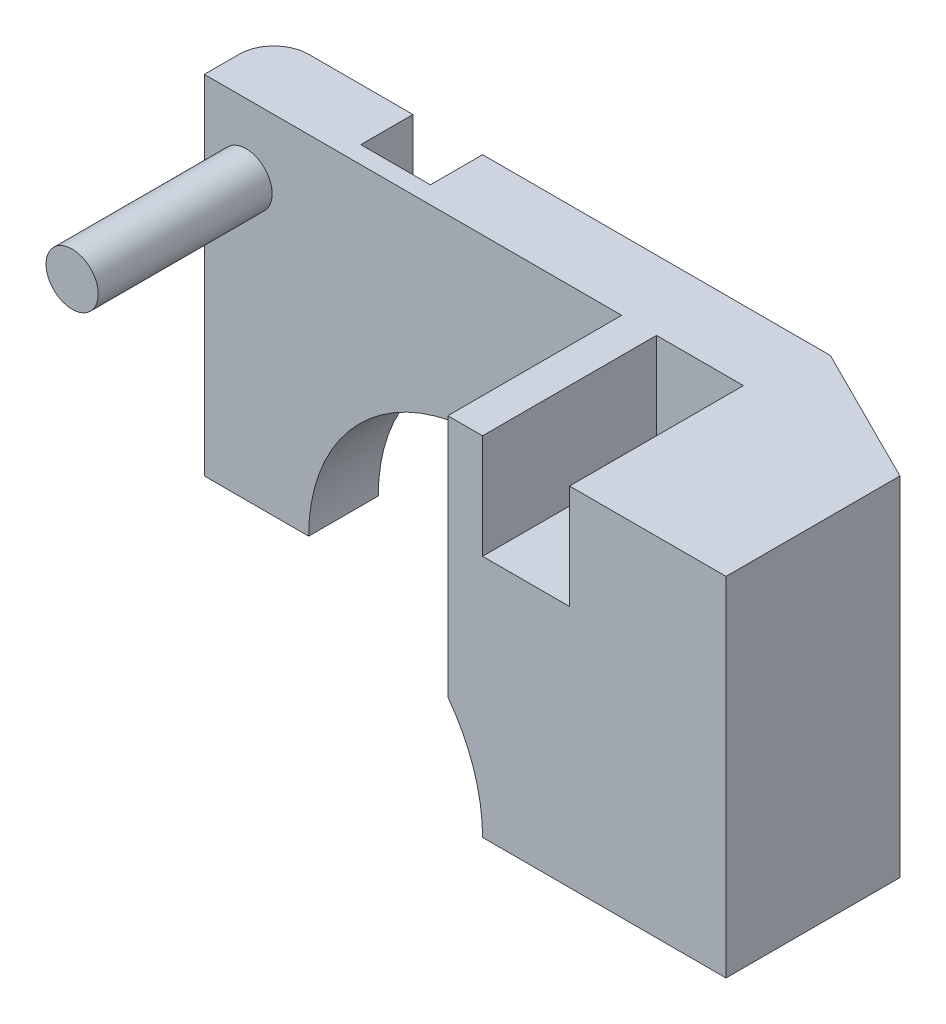
ISO-10303-21;
HEADER;
FILE_DESCRIPTION(('STEP AP214'),'2;1');
FILE_NAME('part.step','',(''),(''),'','','');
FILE_SCHEMA(('AUTOMOTIVE_DESIGN { 1 0 10303 214 1 1 1 1 }'));
ENDSEC;
DATA;
#1=APPLICATION_CONTEXT('core data for automotive mechanical design processes');
#2=APPLICATION_PROTOCOL_DEFINITION('international standard','automotive_design',2000,#1);
#3=PRODUCT_CONTEXT('',#1,'mechanical');
#4=PRODUCT('Part','Part','',(#3));
#5=PRODUCT_RELATED_PRODUCT_CATEGORY('part','',(#4));
#6=PRODUCT_DEFINITION_FORMATION('','',#4);
#7=PRODUCT_DEFINITION_CONTEXT('part definition',#1,'design');
#8=PRODUCT_DEFINITION('design','',#6,#7);
#9=PRODUCT_DEFINITION_SHAPE('','',#8);
#10=(LENGTH_UNIT() NAMED_UNIT(*) SI_UNIT(.MILLI.,.METRE.));
#11=(NAMED_UNIT(*) PLANE_ANGLE_UNIT() SI_UNIT($,.RADIAN.));
#12=(NAMED_UNIT(*) SI_UNIT($,.STERADIAN.) SOLID_ANGLE_UNIT());
#13=UNCERTAINTY_MEASURE_WITH_UNIT(LENGTH_MEASURE(1.E-05),#10,'distance_accuracy_value','');
#14=(GEOMETRIC_REPRESENTATION_CONTEXT(3) GLOBAL_UNCERTAINTY_ASSIGNED_CONTEXT((#13)) GLOBAL_UNIT_ASSIGNED_CONTEXT((#10,
#11,#12)) REPRESENTATION_CONTEXT('',''));
#15=CARTESIAN_POINT('',(0.,0.,0.));
#16=DIRECTION('',(0.,0.,1.));
#17=DIRECTION('',(1.,0.,0.));
#18=AXIS2_PLACEMENT_3D('',#15,#16,#17);
#19=CARTESIAN_POINT('',(0.,0.,20.));
#20=DIRECTION('',(0.,1.,0.));
#21=DIRECTION('',(0.,0.,1.));
#22=AXIS2_PLACEMENT_3D('',#19,#20,#21);
#23=PLANE('',#22);
#24=DIRECTION('',(1.,0.,0.));
#25=VECTOR('',#24,1.);
#26=CARTESIAN_POINT('',(0.,0.,0.));
#27=LINE('',#26,#25);
#28=CARTESIAN_POINT('',(130.,0.,0.));
#29=VERTEX_POINT('',#28);
#30=CARTESIAN_POINT('',(160.,0.,0.));
#31=VERTEX_POINT('',#30);
#32=EDGE_CURVE('E340',#29,#31,#27,.T.);
#33=ORIENTED_EDGE('',*,*,#32,.T.);
#34=DIRECTION('',(0.894427190999917,0.,0.447213595499955));
#35=VECTOR('',#34,1.);
#36=CARTESIAN_POINT('',(200.,0.,20.));
#37=LINE('',#36,#35);
#38=CARTESIAN_POINT('',(200.,0.,20.));
#39=VERTEX_POINT('',#38);
#40=EDGE_CURVE('E11',#31,#39,#37,.T.);
#41=ORIENTED_EDGE('',*,*,#40,.T.);
#42=DIRECTION('',(0.,0.,-1.));
#43=VECTOR('',#42,1.);
#44=CARTESIAN_POINT('',(200.,0.,20.));
#45=LINE('',#44,#43);
#46=CARTESIAN_POINT('',(200.,0.,70.));
#47=VERTEX_POINT('',#46);
#48=EDGE_CURVE('E379',#47,#39,#45,.T.);
#49=ORIENTED_EDGE('',*,*,#48,.F.);
#50=DIRECTION('',(1.,0.,0.));
#51=VECTOR('',#50,1.);
#52=CARTESIAN_POINT('',(120.,0.,70.));
#53=LINE('',#52,#51);
#54=CARTESIAN_POINT('',(130.,0.,70.));
#55=VERTEX_POINT('',#54);
#56=EDGE_CURVE('E316',#55,#47,#53,.T.);
#57=ORIENTED_EDGE('',*,*,#56,.F.);
#58=DIRECTION('',(0.,0.,-1.));
#59=VECTOR('',#58,1.);
#60=CARTESIAN_POINT('',(130.,0.,211.42135623731));
#61=LINE('',#60,#59);
#62=EDGE_CURVE('E287',#55,#29,#61,.T.);
#63=ORIENTED_EDGE('',*,*,#62,.T.);
#64=EDGE_LOOP('',(#33,#41,#49,#57,#63));
#65=FACE_BOUND('',#64,.T.);
#66=ADVANCED_FACE('F41',(#65),#23,.F.);
#67=CARTESIAN_POINT('',(0.,0.,20.));
#68=DIRECTION('',(0.,0.,-1.));
#69=DIRECTION('',(-1.,0.,0.));
#70=AXIS2_PLACEMENT_3D('',#67,#68,#69);
#71=PLANE('',#70);
#72=DIRECTION('',(-1.,0.,0.));
#73=VECTOR('',#72,1.);
#74=CARTESIAN_POINT('',(0.,100.,20.));
#75=LINE('',#74,#73);
#76=CARTESIAN_POINT('',(155.,100.,20.));
#77=VERTEX_POINT('',#76);
#78=CARTESIAN_POINT('',(130.,100.,20.));
#79=VERTEX_POINT('',#78);
#80=EDGE_CURVE('E364',#77,#79,#75,.T.);
#81=ORIENTED_EDGE('',*,*,#80,.T.);
#82=DIRECTION('',(0.,-1.,0.));
#83=VECTOR('',#82,1.);
#84=CARTESIAN_POINT('',(130.,100.,20.));
#85=LINE('',#84,#83);
#86=CARTESIAN_POINT('',(130.,70.,20.));
#87=VERTEX_POINT('',#86);
#88=EDGE_CURVE('E291',#79,#87,#85,.T.);
#89=ORIENTED_EDGE('',*,*,#88,.T.);
#90=DIRECTION('',(1.,0.,0.));
#91=VECTOR('',#90,1.);
#92=CARTESIAN_POINT('',(130.,70.,20.));
#93=LINE('',#92,#91);
#94=CARTESIAN_POINT('',(155.,70.,20.));
#95=VERTEX_POINT('',#94);
#96=EDGE_CURVE('E326',#87,#95,#93,.T.);
#97=ORIENTED_EDGE('',*,*,#96,.T.);
#98=DIRECTION('',(0.,-1.,0.));
#99=VECTOR('',#98,1.);
#100=CARTESIAN_POINT('',(155.,100.,20.));
#101=LINE('',#100,#99);
#102=EDGE_CURVE('E330',#77,#95,#101,.T.);
#103=ORIENTED_EDGE('',*,*,#102,.F.);
#104=EDGE_LOOP('',(#81,#89,#97,#103));
#105=FACE_BOUND('',#104,.T.);
#106=ADVANCED_FACE('F465',(#105),#71,.F.);
#107=CARTESIAN_POINT('',(0.,0.,20.));
#108=DIRECTION('',(1.,0.,0.));
#109=DIRECTION('',(0.,0.,-1.));
#110=AXIS2_PLACEMENT_3D('',#107,#108,#109);
#111=PLANE('',#110);
#112=DIRECTION('',(0.,0.,-1.));
#113=VECTOR('',#112,1.);
#114=CARTESIAN_POINT('',(0.,100.,20.));
#115=LINE('',#114,#113);
#116=CARTESIAN_POINT('',(0.,100.,20.));
#117=VERTEX_POINT('',#116);
#118=CARTESIAN_POINT('',(0.,100.,10.));
#119=VERTEX_POINT('',#118);
#120=EDGE_CURVE('E371',#117,#119,#115,.T.);
#121=ORIENTED_EDGE('',*,*,#120,.T.);
#122=DIRECTION('',(0.,-1.,0.));
#123=VECTOR('',#122,1.);
#124=CARTESIAN_POINT('',(0.,0.,10.));
#125=LINE('',#124,#123);
#126=CARTESIAN_POINT('',(0.,0.,10.));
#127=VERTEX_POINT('',#126);
#128=EDGE_CURVE('E391',#119,#127,#125,.T.);
#129=ORIENTED_EDGE('',*,*,#128,.T.);
#130=DIRECTION('',(0.,0.,-1.));
#131=VECTOR('',#130,1.);
#132=CARTESIAN_POINT('',(0.,0.,20.));
#133=LINE('',#132,#131);
#134=CARTESIAN_POINT('',(0.,0.,20.));
#135=VERTEX_POINT('',#134);
#136=EDGE_CURVE('E383',#135,#127,#133,.T.);
#137=ORIENTED_EDGE('',*,*,#136,.F.);
#138=DIRECTION('',(0.,-1.,0.));
#139=VECTOR('',#138,1.);
#140=CARTESIAN_POINT('',(0.,0.,20.));
#141=LINE('',#140,#139);
#142=EDGE_CURVE('E352',#117,#135,#141,.T.);
#143=ORIENTED_EDGE('',*,*,#142,.F.);
#144=EDGE_LOOP('',(#121,#129,#137,#143));
#145=FACE_BOUND('',#144,.T.);
#146=ADVANCED_FACE('F462',(#145),#111,.F.);
#147=ORIENTED_EDGE('',*,*,#136,.T.);
#148=CARTESIAN_POINT('',(10.,0.,10.));
#149=DIRECTION('',(0.,1.,0.));
#150=DIRECTION('',(0.,0.,1.));
#151=AXIS2_PLACEMENT_3D('',#148,#149,#150);
#152=CIRCLE('',#151,10.);
#153=CARTESIAN_POINT('',(10.,0.,0.));
#154=VERTEX_POINT('',#153);
#155=EDGE_CURVE('E395',#127,#154,#152,.F.);
#156=ORIENTED_EDGE('',*,*,#155,.T.);
#157=CARTESIAN_POINT('',(30.,0.,0.));
#158=VERTEX_POINT('',#157);
#159=EDGE_CURVE('E365',#154,#158,#27,.T.);
#160=ORIENTED_EDGE('',*,*,#159,.T.);
#161=DIRECTION('',(0.,0.,-1.));
#162=VECTOR('',#161,1.);
#163=CARTESIAN_POINT('',(30.,0.,211.42135623731));
#164=LINE('',#163,#162);
#165=CARTESIAN_POINT('',(30.,0.,20.));
#166=VERTEX_POINT('',#165);
#167=EDGE_CURVE('E283',#158,#166,#164,.F.);
#168=ORIENTED_EDGE('',*,*,#167,.T.);
#169=DIRECTION('',(1.,0.,0.));
#170=VECTOR('',#169,1.);
#171=CARTESIAN_POINT('',(0.,0.,20.));
#172=LINE('',#171,#170);
#173=EDGE_CURVE('E356',#135,#166,#172,.T.);
#174=ORIENTED_EDGE('',*,*,#173,.F.);
#175=EDGE_LOOP('',(#147,#156,#160,#168,#174));
#176=FACE_BOUND('',#175,.T.);
#177=ADVANCED_FACE('F451',(#176),#23,.F.);
#178=CARTESIAN_POINT('',(200.,0.,20.));
#179=DIRECTION('',(-1.,0.,0.));
#180=DIRECTION('',(0.,0.,1.));
#181=AXIS2_PLACEMENT_3D('',#178,#179,#180);
#182=PLANE('',#181);
#183=ORIENTED_EDGE('',*,*,#48,.T.);
#184=DIRECTION('',(0.,1.,0.));
#185=VECTOR('',#184,1.);
#186=CARTESIAN_POINT('',(200.,100.,20.));
#187=LINE('',#186,#185);
#188=CARTESIAN_POINT('',(200.,100.,20.));
#189=VERTEX_POINT('',#188);
#190=EDGE_CURVE('E404',#39,#189,#187,.T.);
#191=ORIENTED_EDGE('',*,*,#190,.T.);
#192=DIRECTION('',(0.,0.,-1.));
#193=VECTOR('',#192,1.);
#194=CARTESIAN_POINT('',(200.,100.,20.));
#195=LINE('',#194,#193);
#196=CARTESIAN_POINT('',(200.,100.,70.));
#197=VERTEX_POINT('',#196);
#198=EDGE_CURVE('E375',#197,#189,#195,.T.);
#199=ORIENTED_EDGE('',*,*,#198,.F.);
#200=DIRECTION('',(0.,1.,0.));
#201=VECTOR('',#200,1.);
#202=CARTESIAN_POINT('',(200.,0.,70.));
#203=LINE('',#202,#201);
#204=EDGE_CURVE('E312',#47,#197,#203,.T.);
#205=ORIENTED_EDGE('',*,*,#204,.F.);
#206=EDGE_LOOP('',(#183,#191,#199,#205));
#207=FACE_BOUND('',#206,.T.);
#208=ADVANCED_FACE('F424',(#207),#182,.F.);
#209=CARTESIAN_POINT('',(0.,100.,20.));
#210=DIRECTION('',(0.,-1.,0.));
#211=DIRECTION('',(0.,0.,-1.));
#212=AXIS2_PLACEMENT_3D('',#209,#210,#211);
#213=PLANE('',#212);
#214=ORIENTED_EDGE('',*,*,#198,.T.);
#215=DIRECTION('',(-0.894427190999917,0.,-0.447213595499955));
#216=VECTOR('',#215,1.);
#217=CARTESIAN_POINT('',(200.,100.,20.));
#218=LINE('',#217,#216);
#219=CARTESIAN_POINT('',(160.,100.,0.));
#220=VERTEX_POINT('',#219);
#221=EDGE_CURVE('E408',#189,#220,#218,.T.);
#222=ORIENTED_EDGE('',*,*,#221,.T.);
#223=DIRECTION('',(-1.,0.,0.));
#224=VECTOR('',#223,1.);
#225=CARTESIAN_POINT('',(0.,100.,0.));
#226=LINE('',#225,#224);
#227=CARTESIAN_POINT('',(60.,100.,0.));
#228=VERTEX_POINT('',#227);
#229=EDGE_CURVE('E357',#220,#228,#226,.T.);
#230=ORIENTED_EDGE('',*,*,#229,.T.);
#231=DIRECTION('',(0.,0.,-1.));
#232=VECTOR('',#231,1.);
#233=CARTESIAN_POINT('',(60.,100.,15.));
#234=LINE('',#233,#232);
#235=CARTESIAN_POINT('',(60.,100.,15.));
#236=VERTEX_POINT('',#235);
#237=EDGE_CURVE('E245',#236,#228,#234,.T.);
#238=ORIENTED_EDGE('',*,*,#237,.F.);
#239=DIRECTION('',(-1.,0.,0.));
#240=VECTOR('',#239,1.);
#241=CARTESIAN_POINT('',(60.,100.,15.));
#242=LINE('',#241,#240);
#243=CARTESIAN_POINT('',(40.,100.,15.));
#244=VERTEX_POINT('',#243);
#245=EDGE_CURVE('E249',#236,#244,#242,.T.);
#246=ORIENTED_EDGE('',*,*,#245,.T.);
#247=DIRECTION('',(0.,0.,-1.));
#248=VECTOR('',#247,1.);
#249=CARTESIAN_POINT('',(40.,100.,15.));
#250=LINE('',#249,#248);
#251=CARTESIAN_POINT('',(40.,100.,0.));
#252=VERTEX_POINT('',#251);
#253=EDGE_CURVE('E241',#244,#252,#250,.T.);
#254=ORIENTED_EDGE('',*,*,#253,.T.);
#255=CARTESIAN_POINT('',(10.,100.,0.));
#256=VERTEX_POINT('',#255);
#257=EDGE_CURVE('E368',#252,#256,#226,.T.);
#258=ORIENTED_EDGE('',*,*,#257,.T.);
#259=CARTESIAN_POINT('',(10.,100.,10.));
#260=DIRECTION('',(0.,-1.,0.));
#261=DIRECTION('',(0.,0.,-1.));
#262=AXIS2_PLACEMENT_3D('',#259,#260,#261);
#263=CIRCLE('',#262,10.);
#264=EDGE_CURVE('E401',#256,#119,#263,.F.);
#265=ORIENTED_EDGE('',*,*,#264,.T.);
#266=ORIENTED_EDGE('',*,*,#120,.F.);
#267=CARTESIAN_POINT('',(120.,100.,20.));
#268=VERTEX_POINT('',#267);
#269=EDGE_CURVE('E361',#268,#117,#75,.T.);
#270=ORIENTED_EDGE('',*,*,#269,.F.);
#271=DIRECTION('',(0.,0.,-1.));
#272=VECTOR('',#271,1.);
#273=CARTESIAN_POINT('',(120.,100.,70.));
#274=LINE('',#273,#272);
#275=CARTESIAN_POINT('',(120.,100.,70.));
#276=VERTEX_POINT('',#275);
#277=EDGE_CURVE('E336',#276,#268,#274,.T.);
#278=ORIENTED_EDGE('',*,*,#277,.F.);
#279=DIRECTION('',(1.,0.,0.));
#280=VECTOR('',#279,1.);
#281=CARTESIAN_POINT('',(120.,100.,70.));
#282=LINE('',#281,#280);
#283=CARTESIAN_POINT('',(130.,100.,70.));
#284=VERTEX_POINT('',#283);
#285=EDGE_CURVE('E292',#276,#284,#282,.T.);
#286=ORIENTED_EDGE('',*,*,#285,.T.);
#287=DIRECTION('',(0.,0.,-1.));
#288=VECTOR('',#287,1.);
#289=CARTESIAN_POINT('',(130.,100.,70.));
#290=LINE('',#289,#288);
#291=EDGE_CURVE('E322',#284,#79,#290,.T.);
#292=ORIENTED_EDGE('',*,*,#291,.T.);
#293=ORIENTED_EDGE('',*,*,#80,.F.);
#294=DIRECTION('',(0.,0.,-1.));
#295=VECTOR('',#294,1.);
#296=CARTESIAN_POINT('',(155.,100.,70.));
#297=LINE('',#296,#295);
#298=CARTESIAN_POINT('',(155.,100.,70.));
#299=VERTEX_POINT('',#298);
#300=EDGE_CURVE('E341',#299,#77,#297,.T.);
#301=ORIENTED_EDGE('',*,*,#300,.F.);
#302=DIRECTION('',(1.,0.,0.));
#303=VECTOR('',#302,1.);
#304=CARTESIAN_POINT('',(155.,100.,70.));
#305=LINE('',#304,#303);
#306=EDGE_CURVE('E308',#299,#197,#305,.T.);
#307=ORIENTED_EDGE('',*,*,#306,.T.);
#308=EDGE_LOOP('',(#214,#222,#230,#238,#246,#254,#258,#265,#266,#270,#278,#286,#292,#293,#301,#307));
#309=FACE_BOUND('',#308,.T.);
#310=ADVANCED_FACE('F427',(#309),#213,.F.);
#311=CARTESIAN_POINT('',(12.,80.,20.));
#312=DIRECTION('',(0.,0.,-1.));
#313=DIRECTION('',(-1.,0.,0.));
#314=AXIS2_PLACEMENT_3D('',#311,#312,#313);
#315=CIRCLE('',#314,7.5);
#316=CARTESIAN_POINT('',(4.5,80.,20.));
#317=VERTEX_POINT('',#316);
#318=EDGE_CURVE('E387',#317,#317,#315,.F.);
#319=ORIENTED_EDGE('',*,*,#318,.F.);
#320=EDGE_LOOP('',(#319));
#321=FACE_BOUND('',#320,.T.);
#322=ORIENTED_EDGE('',*,*,#173,.T.);
#323=CARTESIAN_POINT('',(80.,0.,20.));
#324=DIRECTION('',(0.,0.,-1.));
#325=DIRECTION('',(-1.,0.,0.));
#326=AXIS2_PLACEMENT_3D('',#323,#324,#325);
#327=CIRCLE('',#326,50.);
#328=CARTESIAN_POINT('',(120.,30.,20.));
#329=VERTEX_POINT('',#328);
#330=EDGE_CURVE('E279',#166,#329,#327,.T.);
#331=ORIENTED_EDGE('',*,*,#330,.T.);
#332=DIRECTION('',(0.,1.,0.));
#333=VECTOR('',#332,1.);
#334=CARTESIAN_POINT('',(120.,0.,20.));
#335=LINE('',#334,#333);
#336=EDGE_CURVE('E297',#329,#268,#335,.T.);
#337=ORIENTED_EDGE('',*,*,#336,.T.);
#338=ORIENTED_EDGE('',*,*,#269,.T.);
#339=ORIENTED_EDGE('',*,*,#142,.T.);
#340=EDGE_LOOP('',(#322,#331,#337,#338,#339));
#341=FACE_BOUND('',#340,.T.);
#342=ADVANCED_FACE('F447',(#321,#341),#71,.F.);
#343=CARTESIAN_POINT('',(0.,0.,0.));
#344=DIRECTION('',(0.,0.,-1.));
#345=DIRECTION('',(-1.,0.,0.));
#346=AXIS2_PLACEMENT_3D('',#343,#344,#345);
#347=PLANE('',#346);
#348=DIRECTION('',(0.,1.,0.));
#349=VECTOR('',#348,1.);
#350=CARTESIAN_POINT('',(70.,90.,0.));
#351=LINE('',#350,#349);
#352=CARTESIAN_POINT('',(70.,65.,0.));
#353=VERTEX_POINT('',#352);
#354=CARTESIAN_POINT('',(70.,90.,0.));
#355=VERTEX_POINT('',#354);
#356=EDGE_CURVE('E58',#353,#355,#351,.T.);
#357=ORIENTED_EDGE('',*,*,#356,.F.);
#358=DIRECTION('',(-1.,0.,0.));
#359=VECTOR('',#358,1.);
#360=CARTESIAN_POINT('',(70.,65.,0.));
#361=LINE('',#360,#359);
#362=CARTESIAN_POINT('',(110.,65.,0.));
#363=VERTEX_POINT('',#362);
#364=EDGE_CURVE('E209',#363,#353,#361,.T.);
#365=ORIENTED_EDGE('',*,*,#364,.F.);
#366=DIRECTION('',(0.,-1.,0.));
#367=VECTOR('',#366,1.);
#368=CARTESIAN_POINT('',(110.,90.,0.));
#369=LINE('',#368,#367);
#370=CARTESIAN_POINT('',(110.,90.,0.));
#371=VERTEX_POINT('',#370);
#372=EDGE_CURVE('E213',#371,#363,#369,.T.);
#373=ORIENTED_EDGE('',*,*,#372,.F.);
#374=DIRECTION('',(1.,0.,0.));
#375=VECTOR('',#374,1.);
#376=CARTESIAN_POINT('',(70.,90.,0.));
#377=LINE('',#376,#375);
#378=EDGE_CURVE('E222',#355,#371,#377,.T.);
#379=ORIENTED_EDGE('',*,*,#378,.F.);
#380=EDGE_LOOP('',(#357,#365,#373,#379));
#381=FACE_BOUND('',#380,.T.);
#382=ORIENTED_EDGE('',*,*,#229,.F.);
#383=DIRECTION('',(0.,-1.,0.));
#384=VECTOR('',#383,1.);
#385=CARTESIAN_POINT('',(160.,0.,0.));
#386=LINE('',#385,#384);
#387=EDGE_CURVE('E51',#220,#31,#386,.T.);
#388=ORIENTED_EDGE('',*,*,#387,.T.);
#389=ORIENTED_EDGE('',*,*,#32,.F.);
#390=CARTESIAN_POINT('',(80.,0.,0.));
#391=DIRECTION('',(0.,0.,-1.));
#392=DIRECTION('',(-1.,0.,0.));
#393=AXIS2_PLACEMENT_3D('',#390,#391,#392);
#394=CIRCLE('',#393,50.);
#395=EDGE_CURVE('E270',#158,#29,#394,.T.);
#396=ORIENTED_EDGE('',*,*,#395,.F.);
#397=ORIENTED_EDGE('',*,*,#159,.F.);
#398=DIRECTION('',(0.,-1.,0.));
#399=VECTOR('',#398,1.);
#400=CARTESIAN_POINT('',(10.,100.,0.));
#401=LINE('',#400,#399);
#402=EDGE_CURVE('E398',#154,#256,#401,.F.);
#403=ORIENTED_EDGE('',*,*,#402,.T.);
#404=ORIENTED_EDGE('',*,*,#257,.F.);
#405=DIRECTION('',(0.,-1.,0.));
#406=VECTOR('',#405,1.);
#407=CARTESIAN_POINT('',(40.,100.,0.));
#408=LINE('',#407,#406);
#409=CARTESIAN_POINT('',(40.,70.,0.));
#410=VERTEX_POINT('',#409);
#411=EDGE_CURVE('E252',#252,#410,#408,.T.);
#412=ORIENTED_EDGE('',*,*,#411,.T.);
#413=DIRECTION('',(-1.,0.,0.));
#414=VECTOR('',#413,1.);
#415=CARTESIAN_POINT('',(60.,70.,0.));
#416=LINE('',#415,#414);
#417=CARTESIAN_POINT('',(60.,70.,0.));
#418=VERTEX_POINT('',#417);
#419=EDGE_CURVE('E262',#418,#410,#416,.T.);
#420=ORIENTED_EDGE('',*,*,#419,.F.);
#421=DIRECTION('',(0.,-1.,0.));
#422=VECTOR('',#421,1.);
#423=CARTESIAN_POINT('',(60.,100.,0.));
#424=LINE('',#423,#422);
#425=EDGE_CURVE('E240',#228,#418,#424,.T.);
#426=ORIENTED_EDGE('',*,*,#425,.F.);
#427=EDGE_LOOP('',(#382,#388,#389,#396,#397,#403,#404,#412,#420,#426));
#428=FACE_BOUND('',#427,.T.);
#429=ADVANCED_FACE('F454',(#381,#428),#347,.T.);
#430=CARTESIAN_POINT('',(120.,0.,70.));
#431=DIRECTION('',(-1.,0.,0.));
#432=DIRECTION('',(0.,0.,1.));
#433=AXIS2_PLACEMENT_3D('',#430,#431,#432);
#434=PLANE('',#433);
#435=DIRECTION('',(0.,0.,-1.));
#436=VECTOR('',#435,1.);
#437=CARTESIAN_POINT('',(120.,30.,211.42135623731));
#438=LINE('',#437,#436);
#439=CARTESIAN_POINT('',(120.,30.,70.));
#440=VERTEX_POINT('',#439);
#441=EDGE_CURVE('E276',#440,#329,#438,.T.);
#442=ORIENTED_EDGE('',*,*,#441,.F.);
#443=DIRECTION('',(0.,1.,0.));
#444=VECTOR('',#443,1.);
#445=CARTESIAN_POINT('',(120.,0.,70.));
#446=LINE('',#445,#444);
#447=EDGE_CURVE('E319',#440,#276,#446,.T.);
#448=ORIENTED_EDGE('',*,*,#447,.T.);
#449=ORIENTED_EDGE('',*,*,#277,.T.);
#450=ORIENTED_EDGE('',*,*,#336,.F.);
#451=EDGE_LOOP('',(#442,#448,#449,#450));
#452=FACE_BOUND('',#451,.T.);
#453=ADVANCED_FACE('F443',(#452),#434,.T.);
#454=CARTESIAN_POINT('',(155.,100.,70.));
#455=DIRECTION('',(1.,0.,0.));
#456=DIRECTION('',(0.,0.,-1.));
#457=AXIS2_PLACEMENT_3D('',#454,#455,#456);
#458=PLANE('',#457);
#459=ORIENTED_EDGE('',*,*,#102,.T.);
#460=DIRECTION('',(0.,0.,-1.));
#461=VECTOR('',#460,1.);
#462=CARTESIAN_POINT('',(155.,70.,70.));
#463=LINE('',#462,#461);
#464=CARTESIAN_POINT('',(155.,70.,70.));
#465=VERTEX_POINT('',#464);
#466=EDGE_CURVE('E344',#465,#95,#463,.T.);
#467=ORIENTED_EDGE('',*,*,#466,.F.);
#468=DIRECTION('',(0.,-1.,0.));
#469=VECTOR('',#468,1.);
#470=CARTESIAN_POINT('',(155.,100.,70.));
#471=LINE('',#470,#469);
#472=EDGE_CURVE('E305',#299,#465,#471,.T.);
#473=ORIENTED_EDGE('',*,*,#472,.F.);
#474=ORIENTED_EDGE('',*,*,#300,.T.);
#475=EDGE_LOOP('',(#459,#467,#473,#474));
#476=FACE_BOUND('',#475,.T.);
#477=ADVANCED_FACE('F494',(#476),#458,.F.);
#478=CARTESIAN_POINT('',(130.,70.,70.));
#479=DIRECTION('',(0.,1.,0.));
#480=DIRECTION('',(0.,0.,1.));
#481=AXIS2_PLACEMENT_3D('',#478,#479,#480);
#482=PLANE('',#481);
#483=ORIENTED_EDGE('',*,*,#96,.F.);
#484=DIRECTION('',(0.,0.,-1.));
#485=VECTOR('',#484,1.);
#486=CARTESIAN_POINT('',(130.,70.,70.));
#487=LINE('',#486,#485);
#488=CARTESIAN_POINT('',(130.,70.,70.));
#489=VERTEX_POINT('',#488);
#490=EDGE_CURVE('E347',#489,#87,#487,.T.);
#491=ORIENTED_EDGE('',*,*,#490,.F.);
#492=DIRECTION('',(1.,0.,0.));
#493=VECTOR('',#492,1.);
#494=CARTESIAN_POINT('',(130.,70.,70.));
#495=LINE('',#494,#493);
#496=EDGE_CURVE('E301',#489,#465,#495,.T.);
#497=ORIENTED_EDGE('',*,*,#496,.T.);
#498=ORIENTED_EDGE('',*,*,#466,.T.);
#499=EDGE_LOOP('',(#483,#491,#497,#498));
#500=FACE_BOUND('',#499,.T.);
#501=ADVANCED_FACE('F490',(#500),#482,.T.);
#502=CARTESIAN_POINT('',(130.,100.,70.));
#503=DIRECTION('',(1.,0.,0.));
#504=DIRECTION('',(0.,0.,-1.));
#505=AXIS2_PLACEMENT_3D('',#502,#503,#504);
#506=PLANE('',#505);
#507=ORIENTED_EDGE('',*,*,#88,.F.);
#508=ORIENTED_EDGE('',*,*,#291,.F.);
#509=DIRECTION('',(0.,-1.,0.));
#510=VECTOR('',#509,1.);
#511=CARTESIAN_POINT('',(130.,100.,70.));
#512=LINE('',#511,#510);
#513=EDGE_CURVE('E296',#284,#489,#512,.T.);
#514=ORIENTED_EDGE('',*,*,#513,.T.);
#515=ORIENTED_EDGE('',*,*,#490,.T.);
#516=EDGE_LOOP('',(#507,#508,#514,#515));
#517=FACE_BOUND('',#516,.T.);
#518=ADVANCED_FACE('F487',(#517),#506,.T.);
#519=CARTESIAN_POINT('',(0.,0.,70.));
#520=DIRECTION('',(0.,0.,-1.));
#521=DIRECTION('',(-1.,0.,0.));
#522=AXIS2_PLACEMENT_3D('',#519,#520,#521);
#523=PLANE('',#522);
#524=ORIENTED_EDGE('',*,*,#447,.F.);
#525=CARTESIAN_POINT('',(80.,0.,70.));
#526=DIRECTION('',(0.,0.,-1.));
#527=DIRECTION('',(-1.,0.,0.));
#528=AXIS2_PLACEMENT_3D('',#525,#526,#527);
#529=CIRCLE('',#528,50.);
#530=EDGE_CURVE('E273',#55,#440,#529,.F.);
#531=ORIENTED_EDGE('',*,*,#530,.F.);
#532=ORIENTED_EDGE('',*,*,#56,.T.);
#533=ORIENTED_EDGE('',*,*,#204,.T.);
#534=ORIENTED_EDGE('',*,*,#306,.F.);
#535=ORIENTED_EDGE('',*,*,#472,.T.);
#536=ORIENTED_EDGE('',*,*,#496,.F.);
#537=ORIENTED_EDGE('',*,*,#513,.F.);
#538=ORIENTED_EDGE('',*,*,#285,.F.);
#539=EDGE_LOOP('',(#524,#531,#532,#533,#534,#535,#536,#537,#538));
#540=FACE_BOUND('',#539,.T.);
#541=ADVANCED_FACE('F433',(#540),#523,.F.);
#542=CARTESIAN_POINT('',(80.,0.,211.42135623731));
#543=DIRECTION('',(0.,0.,-1.));
#544=DIRECTION('',(-1.,0.,0.));
#545=AXIS2_PLACEMENT_3D('',#542,#543,#544);
#546=CYLINDRICAL_SURFACE('',#545,50.);
#547=ORIENTED_EDGE('',*,*,#530,.T.);
#548=ORIENTED_EDGE('',*,*,#441,.T.);
#549=ORIENTED_EDGE('',*,*,#330,.F.);
#550=ORIENTED_EDGE('',*,*,#167,.F.);
#551=ORIENTED_EDGE('',*,*,#395,.T.);
#552=ORIENTED_EDGE('',*,*,#62,.F.);
#553=EDGE_LOOP('',(#547,#548,#549,#550,#551,#552));
#554=FACE_BOUND('',#553,.T.);
#555=ADVANCED_FACE('F440',(#554),#546,.F.);
#556=CARTESIAN_POINT('',(12.,80.,70.));
#557=DIRECTION('',(0.,0.,-1.));
#558=DIRECTION('',(-1.,0.,0.));
#559=AXIS2_PLACEMENT_3D('',#556,#557,#558);
#560=CYLINDRICAL_SURFACE('',#559,7.5);
#561=CARTESIAN_POINT('',(12.,80.,70.));
#562=DIRECTION('',(0.,0.,1.));
#563=DIRECTION('',(1.,0.,0.));
#564=AXIS2_PLACEMENT_3D('',#561,#562,#563);
#565=CIRCLE('',#564,7.5);
#566=CARTESIAN_POINT('',(4.5,80.,70.));
#567=VERTEX_POINT('',#566);
#568=EDGE_CURVE('E266',#567,#567,#565,.T.);
#569=CARTESIAN_POINT('',(4.5,80.,70.));
#570=CARTESIAN_POINT('',(4.5,80.,69.4791666666667));
#571=CARTESIAN_POINT('',(4.5,80.,68.9583333333333));
#572=CARTESIAN_POINT('',(4.5,80.,67.9166666666667));
#573=CARTESIAN_POINT('',(4.5,80.,67.3958333333333));
#574=CARTESIAN_POINT('',(4.5,80.,66.3541666666667));
#575=CARTESIAN_POINT('',(4.5,80.,65.8333333333333));
#576=CARTESIAN_POINT('',(4.5,80.,64.7916666666667));
#577=CARTESIAN_POINT('',(4.5,80.,64.2708333333333));
#578=CARTESIAN_POINT('',(4.5,80.,63.2291666666667));
#579=CARTESIAN_POINT('',(4.5,80.,62.7083333333333));
#580=CARTESIAN_POINT('',(4.5,80.,61.6666666666667));
#581=CARTESIAN_POINT('',(4.5,80.,61.1458333333333));
#582=CARTESIAN_POINT('',(4.5,80.,60.1041666666667));
#583=CARTESIAN_POINT('',(4.5,80.,59.5833333333333));
#584=CARTESIAN_POINT('',(4.5,80.,58.5416666666667));
#585=CARTESIAN_POINT('',(4.5,80.,58.0208333333333));
#586=CARTESIAN_POINT('',(4.5,80.,56.9791666666667));
#587=CARTESIAN_POINT('',(4.5,80.,56.4583333333333));
#588=CARTESIAN_POINT('',(4.5,80.,55.4166666666667));
#589=CARTESIAN_POINT('',(4.5,80.,54.8958333333333));
#590=CARTESIAN_POINT('',(4.5,80.,53.8541666666667));
#591=CARTESIAN_POINT('',(4.5,80.,53.3333333333333));
#592=CARTESIAN_POINT('',(4.5,80.,52.2916666666667));
#593=CARTESIAN_POINT('',(4.5,80.,51.7708333333333));
#594=CARTESIAN_POINT('',(4.5,80.,50.7291666666667));
#595=CARTESIAN_POINT('',(4.5,80.,50.2083333333333));
#596=CARTESIAN_POINT('',(4.5,80.,49.1666666666667));
#597=CARTESIAN_POINT('',(4.5,80.,48.6458333333333));
#598=CARTESIAN_POINT('',(4.5,80.,47.6041666666667));
#599=CARTESIAN_POINT('',(4.5,80.,47.0833333333333));
#600=CARTESIAN_POINT('',(4.5,80.,46.0416666666667));
#601=CARTESIAN_POINT('',(4.5,80.,45.5208333333333));
#602=CARTESIAN_POINT('',(4.5,80.,44.4791666666667));
#603=CARTESIAN_POINT('',(4.5,80.,43.9583333333333));
#604=CARTESIAN_POINT('',(4.5,80.,42.9166666666667));
#605=CARTESIAN_POINT('',(4.5,80.,42.3958333333333));
#606=CARTESIAN_POINT('',(4.5,80.,41.3541666666667));
#607=CARTESIAN_POINT('',(4.5,80.,40.8333333333333));
#608=CARTESIAN_POINT('',(4.5,80.,39.7916666666667));
#609=CARTESIAN_POINT('',(4.5,80.,39.2708333333333));
#610=CARTESIAN_POINT('',(4.5,80.,38.2291666666667));
#611=CARTESIAN_POINT('',(4.5,80.,37.7083333333333));
#612=CARTESIAN_POINT('',(4.5,80.,36.6666666666667));
#613=CARTESIAN_POINT('',(4.5,80.,36.1458333333333));
#614=CARTESIAN_POINT('',(4.5,80.,35.1041666666667));
#615=CARTESIAN_POINT('',(4.5,80.,34.5833333333333));
#616=CARTESIAN_POINT('',(4.5,80.,33.5416666666667));
#617=CARTESIAN_POINT('',(4.5,80.,33.0208333333333));
#618=CARTESIAN_POINT('',(4.5,80.,31.9791666666667));
#619=CARTESIAN_POINT('',(4.5,80.,31.4583333333333));
#620=CARTESIAN_POINT('',(4.5,80.,30.4166666666667));
#621=CARTESIAN_POINT('',(4.5,80.,29.8958333333333));
#622=CARTESIAN_POINT('',(4.5,80.,28.8541666666667));
#623=CARTESIAN_POINT('',(4.5,80.,28.3333333333333));
#624=CARTESIAN_POINT('',(4.5,80.,27.2916666666667));
#625=CARTESIAN_POINT('',(4.5,80.,26.7708333333333));
#626=CARTESIAN_POINT('',(4.5,80.,25.7291666666667));
#627=CARTESIAN_POINT('',(4.5,80.,25.2083333333333));
#628=CARTESIAN_POINT('',(4.5,80.,24.1666666666667));
#629=CARTESIAN_POINT('',(4.5,80.,23.6458333333333));
#630=CARTESIAN_POINT('',(4.5,80.,22.6041666666667));
#631=CARTESIAN_POINT('',(4.5,80.,22.0833333333333));
#632=CARTESIAN_POINT('',(4.5,80.,21.0416666666667));
#633=CARTESIAN_POINT('',(4.5,80.,20.5208333333333));
#634=CARTESIAN_POINT('',(4.5,80.,20.));
#635=B_SPLINE_CURVE_WITH_KNOTS('',3,(#569,#570,#571,#572,#573,#574,#575,#576,#577,#578,#579,
#580,#581,#582,#583,#584,#585,#586,#587,#588,#589,#590,#591,#592,#593,#594,#595,#596,#597,#598,
#599,#600,#601,#602,#603,#604,#605,#606,#607,#608,#609,#610,#611,#612,#613,#614,#615,#616,#617,
#618,#619,#620,#621,#622,#623,#624,#625,#626,#627,#628,#629,#630,#631,#632,#633,#634),
.UNSPECIFIED.,.F.,.F.,(4,2,2,2,2,2,2,2,2,2,2,2,2,2,2,2,2,2,2,2,2,2,2,2,2,2,2,2,2,2,2,2,4),(0.,
1.56249999999999,3.12499999999999,4.6875,6.24999999999999,7.81249999999999,9.37499999999999,
10.9375,12.5,14.0625,15.625,17.1875,18.75,20.3125,21.875,23.4375,25.,26.5625,28.125,29.6875,
31.25,32.8125,34.375,35.9375,37.5,39.0625,40.625,42.1875,43.75,45.3125,46.875,48.4375,50.),.UNSPECIFIED.);
#636=EDGE_CURVE('BSEAM505',#567,#317,#635,.T.);
#637=ORIENTED_EDGE('',*,*,#568,.F.);
#638=ORIENTED_EDGE('',*,*,#318,.T.);
#639=ORIENTED_EDGE('',*,*,#636,.T.);
#640=ORIENTED_EDGE('',*,*,#636,.F.);
#641=EDGE_LOOP('',(#637,#639,#638,#640));
#642=FACE_BOUND('',#641,.T.);
#643=ADVANCED_FACE('F505',(#642),#560,.T.);
#644=CARTESIAN_POINT('',(12.,80.,70.));
#645=DIRECTION('',(0.,0.,1.));
#646=DIRECTION('',(1.,0.,0.));
#647=AXIS2_PLACEMENT_3D('',#644,#645,#646);
#648=PLANE('',#647);
#649=ORIENTED_EDGE('',*,*,#568,.T.);
#650=EDGE_LOOP('',(#649));
#651=FACE_BOUND('',#650,.T.);
#652=ADVANCED_FACE('F508',(#651),#648,.T.);
#653=CARTESIAN_POINT('',(60.,100.,15.));
#654=DIRECTION('',(0.,0.447213595499958,-0.894427190999916));
#655=DIRECTION('',(0.,0.894427190999916,0.447213595499958));
#656=AXIS2_PLACEMENT_3D('',#653,#654,#655);
#657=PLANE('',#656);
#658=DIRECTION('',(0.,-0.894427190999916,-0.447213595499958));
#659=VECTOR('',#658,1.);
#660=CARTESIAN_POINT('',(40.,100.,15.));
#661=LINE('',#660,#659);
#662=EDGE_CURVE('E231',#244,#410,#661,.T.);
#663=ORIENTED_EDGE('',*,*,#662,.F.);
#664=ORIENTED_EDGE('',*,*,#245,.F.);
#665=DIRECTION('',(0.,-0.894427190999916,-0.447213595499958));
#666=VECTOR('',#665,1.);
#667=CARTESIAN_POINT('',(60.,100.,15.));
#668=LINE('',#667,#666);
#669=EDGE_CURVE('E237',#236,#418,#668,.T.);
#670=ORIENTED_EDGE('',*,*,#669,.T.);
#671=ORIENTED_EDGE('',*,*,#419,.T.);
#672=EDGE_LOOP('',(#663,#664,#670,#671));
#673=FACE_BOUND('',#672,.T.);
#674=ADVANCED_FACE('F512',(#673),#657,.T.);
#675=CARTESIAN_POINT('',(60.,0.,0.));
#676=DIRECTION('',(1.,0.,0.));
#677=DIRECTION('',(0.,0.,-1.));
#678=AXIS2_PLACEMENT_3D('',#675,#676,#677);
#679=PLANE('',#678);
#680=ORIENTED_EDGE('',*,*,#669,.F.);
#681=ORIENTED_EDGE('',*,*,#237,.T.);
#682=ORIENTED_EDGE('',*,*,#425,.T.);
#683=EDGE_LOOP('',(#680,#681,#682));
#684=FACE_BOUND('',#683,.T.);
#685=ADVANCED_FACE('F516',(#684),#679,.F.);
#686=CARTESIAN_POINT('',(40.,0.,0.));
#687=DIRECTION('',(1.,0.,0.));
#688=DIRECTION('',(0.,0.,-1.));
#689=AXIS2_PLACEMENT_3D('',#686,#687,#688);
#690=PLANE('',#689);
#691=ORIENTED_EDGE('',*,*,#662,.T.);
#692=ORIENTED_EDGE('',*,*,#411,.F.);
#693=ORIENTED_EDGE('',*,*,#253,.F.);
#694=EDGE_LOOP('',(#691,#692,#693));
#695=FACE_BOUND('',#694,.T.);
#696=ADVANCED_FACE('F518',(#695),#690,.T.);
#697=CARTESIAN_POINT('',(10.,0.,10.));
#698=DIRECTION('',(0.,1.,0.));
#699=DIRECTION('',(0.,0.,1.));
#700=AXIS2_PLACEMENT_3D('',#697,#698,#699);
#701=CYLINDRICAL_SURFACE('',#700,10.);
#702=ORIENTED_EDGE('',*,*,#264,.F.);
#703=ORIENTED_EDGE('',*,*,#402,.F.);
#704=ORIENTED_EDGE('',*,*,#155,.F.);
#705=ORIENTED_EDGE('',*,*,#128,.F.);
#706=EDGE_LOOP('',(#702,#703,#704,#705));
#707=FACE_BOUND('',#706,.T.);
#708=ADVANCED_FACE('F458',(#707),#701,.T.);
#709=CARTESIAN_POINT('',(200.,0.,20.));
#710=DIRECTION('',(0.447213595499955,0.,-0.894427190999917));
#711=DIRECTION('',(0.,-1.,0.));
#712=AXIS2_PLACEMENT_3D('',#709,#710,#711);
#713=PLANE('',#712);
#714=ORIENTED_EDGE('',*,*,#40,.F.);
#715=ORIENTED_EDGE('',*,*,#387,.F.);
#716=ORIENTED_EDGE('',*,*,#221,.F.);
#717=ORIENTED_EDGE('',*,*,#190,.F.);
#718=EDGE_LOOP('',(#714,#715,#716,#717));
#719=FACE_BOUND('',#718,.T.);
#720=ADVANCED_FACE('F44',(#719),#713,.T.);
#721=CARTESIAN_POINT('',(70.,90.,5.));
#722=DIRECTION('',(-1.,0.,0.));
#723=DIRECTION('',(0.,0.,1.));
#724=AXIS2_PLACEMENT_3D('',#721,#722,#723);
#725=PLANE('',#724);
#726=ORIENTED_EDGE('',*,*,#356,.T.);
#727=DIRECTION('',(0.,0.,-1.));
#728=VECTOR('',#727,1.);
#729=CARTESIAN_POINT('',(70.,90.,5.));
#730=LINE('',#729,#728);
#731=CARTESIAN_POINT('',(70.,90.,5.));
#732=VERTEX_POINT('',#731);
#733=EDGE_CURVE('E184',#732,#355,#730,.T.);
#734=ORIENTED_EDGE('',*,*,#733,.F.);
#735=DIRECTION('',(0.,1.,0.));
#736=VECTOR('',#735,1.);
#737=CARTESIAN_POINT('',(70.,90.,5.));
#738=LINE('',#737,#736);
#739=CARTESIAN_POINT('',(70.,65.,5.));
#740=VERTEX_POINT('',#739);
#741=EDGE_CURVE('E188',#740,#732,#738,.T.);
#742=ORIENTED_EDGE('',*,*,#741,.F.);
#743=DIRECTION('',(0.,0.,-1.));
#744=VECTOR('',#743,1.);
#745=CARTESIAN_POINT('',(70.,65.,5.));
#746=LINE('',#745,#744);
#747=EDGE_CURVE('E228',#740,#353,#746,.T.);
#748=ORIENTED_EDGE('',*,*,#747,.T.);
#749=EDGE_LOOP('',(#726,#734,#742,#748));
#750=FACE_BOUND('',#749,.T.);
#751=ADVANCED_FACE('F186',(#750),#725,.F.);
#752=CARTESIAN_POINT('',(70.,65.,5.));
#753=DIRECTION('',(0.,-1.,0.));
#754=DIRECTION('',(0.,0.,-1.));
#755=AXIS2_PLACEMENT_3D('',#752,#753,#754);
#756=PLANE('',#755);
#757=ORIENTED_EDGE('',*,*,#364,.T.);
#758=ORIENTED_EDGE('',*,*,#747,.F.);
#759=DIRECTION('',(-1.,0.,0.));
#760=VECTOR('',#759,1.);
#761=CARTESIAN_POINT('',(70.,65.,5.));
#762=LINE('',#761,#760);
#763=CARTESIAN_POINT('',(110.,65.,5.));
#764=VERTEX_POINT('',#763);
#765=EDGE_CURVE('E195',#764,#740,#762,.T.);
#766=ORIENTED_EDGE('',*,*,#765,.F.);
#767=DIRECTION('',(0.,0.,-1.));
#768=VECTOR('',#767,1.);
#769=CARTESIAN_POINT('',(110.,65.,5.));
#770=LINE('',#769,#768);
#771=EDGE_CURVE('E232',#764,#363,#770,.T.);
#772=ORIENTED_EDGE('',*,*,#771,.T.);
#773=EDGE_LOOP('',(#757,#758,#766,#772));
#774=FACE_BOUND('',#773,.T.);
#775=ADVANCED_FACE('F527',(#774),#756,.F.);
#776=CARTESIAN_POINT('',(110.,90.,5.));
#777=DIRECTION('',(1.,0.,0.));
#778=DIRECTION('',(0.,0.,-1.));
#779=AXIS2_PLACEMENT_3D('',#776,#777,#778);
#780=PLANE('',#779);
#781=ORIENTED_EDGE('',*,*,#372,.T.);
#782=ORIENTED_EDGE('',*,*,#771,.F.);
#783=DIRECTION('',(0.,-1.,0.));
#784=VECTOR('',#783,1.);
#785=CARTESIAN_POINT('',(110.,90.,5.));
#786=LINE('',#785,#784);
#787=CARTESIAN_POINT('',(110.,90.,5.));
#788=VERTEX_POINT('',#787);
#789=EDGE_CURVE('E204',#788,#764,#786,.T.);
#790=ORIENTED_EDGE('',*,*,#789,.F.);
#791=DIRECTION('',(0.,0.,-1.));
#792=VECTOR('',#791,1.);
#793=CARTESIAN_POINT('',(110.,90.,5.));
#794=LINE('',#793,#792);
#795=EDGE_CURVE('E194',#788,#371,#794,.T.);
#796=ORIENTED_EDGE('',*,*,#795,.T.);
#797=EDGE_LOOP('',(#781,#782,#790,#796));
#798=FACE_BOUND('',#797,.T.);
#799=ADVANCED_FACE('F530',(#798),#780,.F.);
#800=CARTESIAN_POINT('',(70.,90.,5.));
#801=DIRECTION('',(0.,1.,0.));
#802=DIRECTION('',(0.,0.,1.));
#803=AXIS2_PLACEMENT_3D('',#800,#801,#802);
#804=PLANE('',#803);
#805=ORIENTED_EDGE('',*,*,#378,.T.);
#806=ORIENTED_EDGE('',*,*,#795,.F.);
#807=DIRECTION('',(1.,0.,0.));
#808=VECTOR('',#807,1.);
#809=CARTESIAN_POINT('',(70.,90.,5.));
#810=LINE('',#809,#808);
#811=EDGE_CURVE('E198',#732,#788,#810,.T.);
#812=ORIENTED_EDGE('',*,*,#811,.F.);
#813=ORIENTED_EDGE('',*,*,#733,.T.);
#814=EDGE_LOOP('',(#805,#806,#812,#813));
#815=FACE_BOUND('',#814,.T.);
#816=ADVANCED_FACE('F199',(#815),#804,.F.);
#817=CARTESIAN_POINT('',(0.,0.,5.));
#818=DIRECTION('',(0.,0.,1.));
#819=DIRECTION('',(1.,0.,0.));
#820=AXIS2_PLACEMENT_3D('',#817,#818,#819);
#821=PLANE('',#820);
#822=ORIENTED_EDGE('',*,*,#741,.T.);
#823=ORIENTED_EDGE('',*,*,#811,.T.);
#824=ORIENTED_EDGE('',*,*,#789,.T.);
#825=ORIENTED_EDGE('',*,*,#765,.T.);
#826=EDGE_LOOP('',(#822,#823,#824,#825));
#827=FACE_BOUND('',#826,.T.);
#828=ADVANCED_FACE('F206',(#827),#821,.F.);
#829=CLOSED_SHELL('',(#66,#106,#146,#177,#208,#310,#342,#429,#453,#477,#501,#518,#541,#555,#643,
#652,#674,#685,#696,#708,#720,#751,#775,#799,#816,#828));
#830=MANIFOLD_SOLID_BREP('B2',#829);
#831=ADVANCED_BREP_SHAPE_REPRESENTATION('',(#18,#830),#14);
#832=SHAPE_DEFINITION_REPRESENTATION(#9,#831);
ENDSEC;
END-ISO-10303-21;
